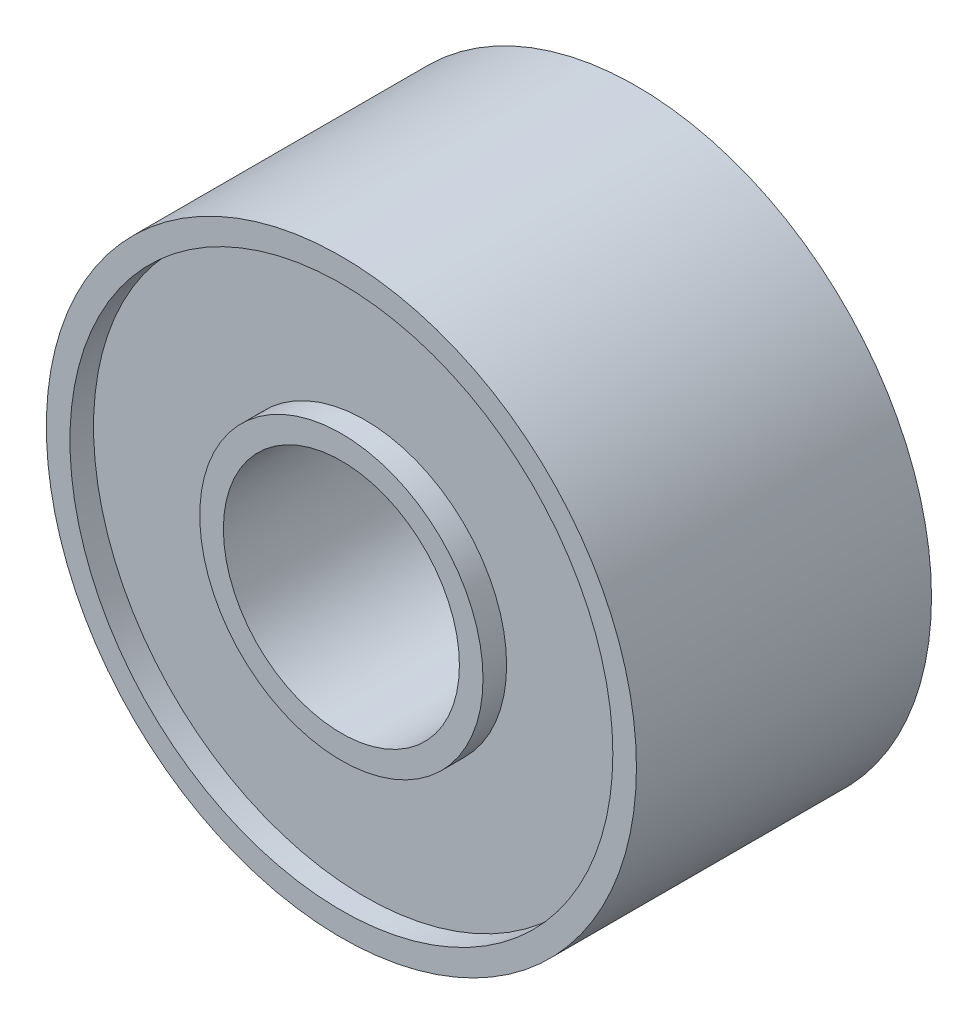
ISO-10303-21;
HEADER;
FILE_DESCRIPTION(('STEP AP214'),'2;1');
FILE_NAME('part.step','',(''),(''),'','','');
FILE_SCHEMA(('AUTOMOTIVE_DESIGN { 1 0 10303 214 1 1 1 1 }'));
ENDSEC;
DATA;
#1=APPLICATION_CONTEXT('core data for automotive mechanical design processes');
#2=APPLICATION_PROTOCOL_DEFINITION('international standard','automotive_design',2000,#1);
#3=PRODUCT_CONTEXT('',#1,'mechanical');
#4=PRODUCT('Part','Part','',(#3));
#5=PRODUCT_RELATED_PRODUCT_CATEGORY('part','',(#4));
#6=PRODUCT_DEFINITION_FORMATION('','',#4);
#7=PRODUCT_DEFINITION_CONTEXT('part definition',#1,'design');
#8=PRODUCT_DEFINITION('design','',#6,#7);
#9=PRODUCT_DEFINITION_SHAPE('','',#8);
#10=(LENGTH_UNIT() NAMED_UNIT(*) SI_UNIT(.MILLI.,.METRE.));
#11=(NAMED_UNIT(*) PLANE_ANGLE_UNIT() SI_UNIT($,.RADIAN.));
#12=(NAMED_UNIT(*) SI_UNIT($,.STERADIAN.) SOLID_ANGLE_UNIT());
#13=UNCERTAINTY_MEASURE_WITH_UNIT(LENGTH_MEASURE(1.E-05),#10,'distance_accuracy_value','');
#14=(GEOMETRIC_REPRESENTATION_CONTEXT(3) GLOBAL_UNCERTAINTY_ASSIGNED_CONTEXT((#13)) GLOBAL_UNIT_ASSIGNED_CONTEXT((#10,
#11,#12)) REPRESENTATION_CONTEXT('',''));
#15=CARTESIAN_POINT('',(0.,0.,0.));
#16=DIRECTION('',(0.,0.,1.));
#17=DIRECTION('',(1.,0.,0.));
#18=AXIS2_PLACEMENT_3D('',#15,#16,#17);
#19=CARTESIAN_POINT('',(0.,0.,-1.25));
#20=DIRECTION('',(0.,0.,1.));
#21=DIRECTION('',(1.,0.,0.));
#22=AXIS2_PLACEMENT_3D('',#19,#20,#21);
#23=PLANE('',#22);
#24=CARTESIAN_POINT('',(0.,0.,-1.25));
#25=DIRECTION('',(0.,0.,1.));
#26=DIRECTION('',(1.,0.,0.));
#27=AXIS2_PLACEMENT_3D('',#24,#25,#26);
#28=CIRCLE('',#27,1.);
#29=CARTESIAN_POINT('',(1.,0.,-1.25));
#30=VERTEX_POINT('',#29);
#31=EDGE_CURVE('E45',#30,#30,#28,.T.);
#32=ORIENTED_EDGE('',*,*,#31,.T.);
#33=EDGE_LOOP('',(#32));
#34=FACE_BOUND('',#33,.T.);
#35=CARTESIAN_POINT('',(0.,0.,-1.25));
#36=DIRECTION('',(0.,0.,1.));
#37=DIRECTION('',(1.,0.,0.));
#38=AXIS2_PLACEMENT_3D('',#35,#36,#37);
#39=CIRCLE('',#38,1.2);
#40=CARTESIAN_POINT('',(1.2,0.,-1.25));
#41=VERTEX_POINT('',#40);
#42=EDGE_CURVE('E86',#41,#41,#39,.T.);
#43=ORIENTED_EDGE('',*,*,#42,.F.);
#44=EDGE_LOOP('',(#43));
#45=FACE_BOUND('',#44,.T.);
#46=ADVANCED_FACE('F37',(#34,#45),#23,.F.);
#47=CARTESIAN_POINT('',(0.,0.,1.25));
#48=DIRECTION('',(0.,0.,1.));
#49=DIRECTION('',(1.,0.,0.));
#50=AXIS2_PLACEMENT_3D('',#47,#48,#49);
#51=PLANE('',#50);
#52=CARTESIAN_POINT('',(0.,0.,1.25));
#53=DIRECTION('',(0.,0.,1.));
#54=DIRECTION('',(1.,0.,0.));
#55=AXIS2_PLACEMENT_3D('',#52,#53,#54);
#56=CIRCLE('',#55,1.);
#57=CARTESIAN_POINT('',(1.,0.,1.25));
#58=VERTEX_POINT('',#57);
#59=EDGE_CURVE('E55',#58,#58,#56,.T.);
#60=ORIENTED_EDGE('',*,*,#59,.F.);
#61=EDGE_LOOP('',(#60));
#62=FACE_BOUND('',#61,.T.);
#63=CARTESIAN_POINT('',(0.,0.,1.25));
#64=DIRECTION('',(0.,0.,1.));
#65=DIRECTION('',(1.,0.,0.));
#66=AXIS2_PLACEMENT_3D('',#63,#64,#65);
#67=CIRCLE('',#66,1.2);
#68=CARTESIAN_POINT('',(1.2,0.,1.25));
#69=VERTEX_POINT('',#68);
#70=EDGE_CURVE('E70',#69,#69,#67,.T.);
#71=ORIENTED_EDGE('',*,*,#70,.T.);
#72=EDGE_LOOP('',(#71));
#73=FACE_BOUND('',#72,.T.);
#74=ADVANCED_FACE('F104',(#62,#73),#51,.T.);
#75=CARTESIAN_POINT('',(0.,0.,-1.25));
#76=DIRECTION('',(0.,0.,1.));
#77=DIRECTION('',(1.,0.,0.));
#78=AXIS2_PLACEMENT_3D('',#75,#76,#77);
#79=CYLINDRICAL_SURFACE('',#78,2.5);
#80=CARTESIAN_POINT('',(0.,0.,-1.25));
#81=DIRECTION('',(0.,0.,1.));
#82=DIRECTION('',(1.,0.,0.));
#83=AXIS2_PLACEMENT_3D('',#80,#81,#82);
#84=CIRCLE('',#83,2.5);
#85=CARTESIAN_POINT('',(2.5,0.,-1.25));
#86=VERTEX_POINT('',#85);
#87=EDGE_CURVE('E10',#86,#86,#84,.T.);
#88=ORIENTED_EDGE('',*,*,#87,.T.);
#89=EDGE_LOOP('',(#88));
#90=FACE_BOUND('',#89,.T.);
#91=CARTESIAN_POINT('',(0.,0.,1.25));
#92=DIRECTION('',(0.,0.,1.));
#93=DIRECTION('',(1.,0.,0.));
#94=AXIS2_PLACEMENT_3D('',#91,#92,#93);
#95=CIRCLE('',#94,2.5);
#96=CARTESIAN_POINT('',(2.5,0.,1.25));
#97=VERTEX_POINT('',#96);
#98=EDGE_CURVE('E50',#97,#97,#95,.T.);
#99=ORIENTED_EDGE('',*,*,#98,.F.);
#100=EDGE_LOOP('',(#99));
#101=FACE_BOUND('',#100,.T.);
#102=ADVANCED_FACE('F39',(#90,#101),#79,.T.);
#103=CARTESIAN_POINT('',(0.,0.,-1.25));
#104=DIRECTION('',(0.,0.,1.));
#105=DIRECTION('',(1.,0.,0.));
#106=AXIS2_PLACEMENT_3D('',#103,#104,#105);
#107=CIRCLE('',#106,2.3);
#108=CARTESIAN_POINT('',(2.3,0.,-1.25));
#109=VERTEX_POINT('',#108);
#110=EDGE_CURVE('E78',#109,#109,#107,.T.);
#111=ORIENTED_EDGE('',*,*,#110,.T.);
#112=EDGE_LOOP('',(#111));
#113=FACE_BOUND('',#112,.T.);
#114=ORIENTED_EDGE('',*,*,#87,.F.);
#115=EDGE_LOOP('',(#114));
#116=FACE_BOUND('',#115,.T.);
#117=ADVANCED_FACE('F105',(#113,#116),#23,.F.);
#118=CARTESIAN_POINT('',(0.,0.,-1.25));
#119=DIRECTION('',(0.,0.,1.));
#120=DIRECTION('',(1.,0.,0.));
#121=AXIS2_PLACEMENT_3D('',#118,#119,#120);
#122=CYLINDRICAL_SURFACE('',#121,1.);
#123=ORIENTED_EDGE('',*,*,#31,.F.);
#124=EDGE_LOOP('',(#123));
#125=FACE_BOUND('',#124,.T.);
#126=ORIENTED_EDGE('',*,*,#59,.T.);
#127=EDGE_LOOP('',(#126));
#128=FACE_BOUND('',#127,.T.);
#129=ADVANCED_FACE('F114',(#125,#128),#122,.F.);
#130=CARTESIAN_POINT('',(0.,0.,1.25));
#131=DIRECTION('',(0.,0.,1.));
#132=DIRECTION('',(1.,0.,0.));
#133=AXIS2_PLACEMENT_3D('',#130,#131,#132);
#134=CIRCLE('',#133,2.3);
#135=CARTESIAN_POINT('',(2.3,0.,1.25));
#136=VERTEX_POINT('',#135);
#137=EDGE_CURVE('E62',#136,#136,#134,.T.);
#138=ORIENTED_EDGE('',*,*,#137,.F.);
#139=EDGE_LOOP('',(#138));
#140=FACE_BOUND('',#139,.T.);
#141=ORIENTED_EDGE('',*,*,#98,.T.);
#142=EDGE_LOOP('',(#141));
#143=FACE_BOUND('',#142,.T.);
#144=ADVANCED_FACE('F111',(#140,#143),#51,.T.);
#145=CARTESIAN_POINT('',(0.,0.,1.05));
#146=DIRECTION('',(0.,0.,1.));
#147=DIRECTION('',(1.,0.,0.));
#148=AXIS2_PLACEMENT_3D('',#145,#146,#147);
#149=CYLINDRICAL_SURFACE('',#148,2.3);
#150=CARTESIAN_POINT('',(0.,0.,1.05));
#151=DIRECTION('',(0.,0.,1.));
#152=DIRECTION('',(1.,0.,0.));
#153=AXIS2_PLACEMENT_3D('',#150,#151,#152);
#154=CIRCLE('',#153,2.3);
#155=CARTESIAN_POINT('',(2.3,0.,1.05));
#156=VERTEX_POINT('',#155);
#157=EDGE_CURVE('E61',#156,#156,#154,.T.);
#158=ORIENTED_EDGE('',*,*,#157,.F.);
#159=EDGE_LOOP('',(#158));
#160=FACE_BOUND('',#159,.T.);
#161=ORIENTED_EDGE('',*,*,#137,.T.);
#162=EDGE_LOOP('',(#161));
#163=FACE_BOUND('',#162,.T.);
#164=ADVANCED_FACE('F140',(#160,#163),#149,.F.);
#165=CARTESIAN_POINT('',(0.,0.,1.05));
#166=DIRECTION('',(0.,0.,1.));
#167=DIRECTION('',(1.,0.,0.));
#168=AXIS2_PLACEMENT_3D('',#165,#166,#167);
#169=PLANE('',#168);
#170=CARTESIAN_POINT('',(0.,0.,1.05));
#171=DIRECTION('',(0.,0.,1.));
#172=DIRECTION('',(1.,0.,0.));
#173=AXIS2_PLACEMENT_3D('',#170,#171,#172);
#174=CIRCLE('',#173,1.2);
#175=CARTESIAN_POINT('',(1.2,0.,1.05));
#176=VERTEX_POINT('',#175);
#177=EDGE_CURVE('E66',#176,#176,#174,.T.);
#178=ORIENTED_EDGE('',*,*,#177,.F.);
#179=EDGE_LOOP('',(#178));
#180=FACE_BOUND('',#179,.T.);
#181=ORIENTED_EDGE('',*,*,#157,.T.);
#182=EDGE_LOOP('',(#181));
#183=FACE_BOUND('',#182,.T.);
#184=ADVANCED_FACE('F136',(#180,#183),#169,.T.);
#185=CARTESIAN_POINT('',(0.,0.,1.05));
#186=DIRECTION('',(0.,0.,1.));
#187=DIRECTION('',(1.,0.,0.));
#188=AXIS2_PLACEMENT_3D('',#185,#186,#187);
#189=CYLINDRICAL_SURFACE('',#188,1.2);
#190=ORIENTED_EDGE('',*,*,#177,.T.);
#191=EDGE_LOOP('',(#190));
#192=FACE_BOUND('',#191,.T.);
#193=ORIENTED_EDGE('',*,*,#70,.F.);
#194=EDGE_LOOP('',(#193));
#195=FACE_BOUND('',#194,.T.);
#196=ADVANCED_FACE('F130',(#192,#195),#189,.T.);
#197=CARTESIAN_POINT('',(0.,0.,-1.05));
#198=DIRECTION('',(0.,0.,-1.));
#199=DIRECTION('',(1.,0.,0.));
#200=AXIS2_PLACEMENT_3D('',#197,#198,#199);
#201=PLANE('',#200);
#202=CARTESIAN_POINT('',(0.,0.,-1.05));
#203=DIRECTION('',(0.,0.,1.));
#204=DIRECTION('',(1.,0.,0.));
#205=AXIS2_PLACEMENT_3D('',#202,#203,#204);
#206=CIRCLE('',#205,2.3);
#207=CARTESIAN_POINT('',(2.3,0.,-1.05));
#208=VERTEX_POINT('',#207);
#209=EDGE_CURVE('E74',#208,#208,#206,.T.);
#210=ORIENTED_EDGE('',*,*,#209,.F.);
#211=EDGE_LOOP('',(#210));
#212=FACE_BOUND('',#211,.T.);
#213=CARTESIAN_POINT('',(0.,0.,-1.05));
#214=DIRECTION('',(0.,0.,1.));
#215=DIRECTION('',(1.,0.,0.));
#216=AXIS2_PLACEMENT_3D('',#213,#214,#215);
#217=CIRCLE('',#216,1.2);
#218=CARTESIAN_POINT('',(1.2,0.,-1.05));
#219=VERTEX_POINT('',#218);
#220=EDGE_CURVE('E82',#219,#219,#217,.T.);
#221=ORIENTED_EDGE('',*,*,#220,.T.);
#222=EDGE_LOOP('',(#221));
#223=FACE_BOUND('',#222,.T.);
#224=ADVANCED_FACE('F94',(#212,#223),#201,.T.);
#225=CARTESIAN_POINT('',(0.,0.,-1.05));
#226=DIRECTION('',(0.,0.,-1.));
#227=DIRECTION('',(-1.,0.,0.));
#228=AXIS2_PLACEMENT_3D('',#225,#226,#227);
#229=CYLINDRICAL_SURFACE('',#228,2.3);
#230=ORIENTED_EDGE('',*,*,#209,.T.);
#231=EDGE_LOOP('',(#230));
#232=FACE_BOUND('',#231,.T.);
#233=ORIENTED_EDGE('',*,*,#110,.F.);
#234=EDGE_LOOP('',(#233));
#235=FACE_BOUND('',#234,.T.);
#236=ADVANCED_FACE('F99',(#232,#235),#229,.F.);
#237=CARTESIAN_POINT('',(0.,0.,-1.05));
#238=DIRECTION('',(0.,0.,-1.));
#239=DIRECTION('',(-1.,0.,0.));
#240=AXIS2_PLACEMENT_3D('',#237,#238,#239);
#241=CYLINDRICAL_SURFACE('',#240,1.2);
#242=ORIENTED_EDGE('',*,*,#220,.F.);
#243=EDGE_LOOP('',(#242));
#244=FACE_BOUND('',#243,.T.);
#245=ORIENTED_EDGE('',*,*,#42,.T.);
#246=EDGE_LOOP('',(#245));
#247=FACE_BOUND('',#246,.T.);
#248=ADVANCED_FACE('F96',(#244,#247),#241,.T.);
#249=CLOSED_SHELL('',(#46,#74,#102,#117,#129,#144,#164,#184,#196,#224,#236,#248));
#250=MANIFOLD_SOLID_BREP('B2',#249);
#251=ADVANCED_BREP_SHAPE_REPRESENTATION('',(#18,#250),#14);
#252=SHAPE_DEFINITION_REPRESENTATION(#9,#251);
ENDSEC;
END-ISO-10303-21;
